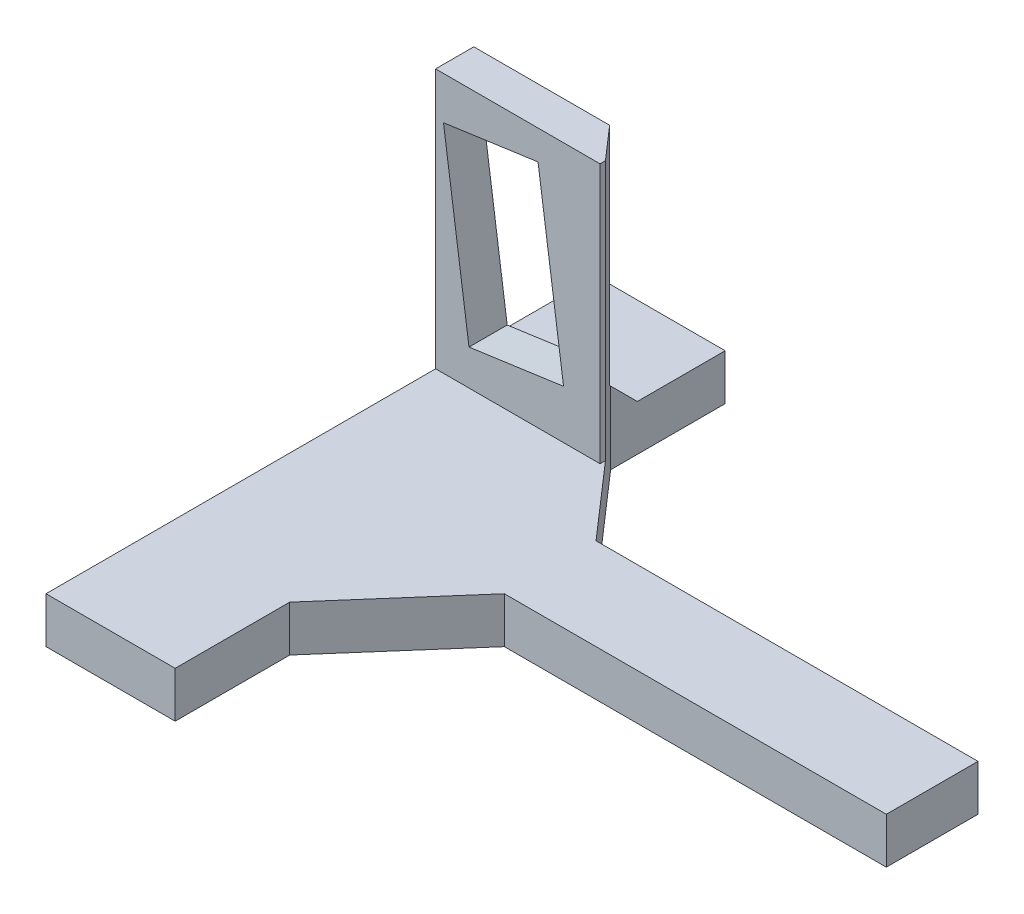
ISO-10303-21;
HEADER;
FILE_DESCRIPTION(('STEP AP214'),'2;1');
FILE_NAME('part.step','',(''),(''),'','','');
FILE_SCHEMA(('AUTOMOTIVE_DESIGN { 1 0 10303 214 1 1 1 1 }'));
ENDSEC;
DATA;
#1=APPLICATION_CONTEXT('core data for automotive mechanical design processes');
#2=APPLICATION_PROTOCOL_DEFINITION('international standard','automotive_design',2000,#1);
#3=PRODUCT_CONTEXT('',#1,'mechanical');
#4=PRODUCT('Part','Part','',(#3));
#5=PRODUCT_RELATED_PRODUCT_CATEGORY('part','',(#4));
#6=PRODUCT_DEFINITION_FORMATION('','',#4);
#7=PRODUCT_DEFINITION_CONTEXT('part definition',#1,'design');
#8=PRODUCT_DEFINITION('design','',#6,#7);
#9=PRODUCT_DEFINITION_SHAPE('','',#8);
#10=(LENGTH_UNIT() NAMED_UNIT(*) SI_UNIT(.MILLI.,.METRE.));
#11=(NAMED_UNIT(*) PLANE_ANGLE_UNIT() SI_UNIT($,.RADIAN.));
#12=(NAMED_UNIT(*) SI_UNIT($,.STERADIAN.) SOLID_ANGLE_UNIT());
#13=UNCERTAINTY_MEASURE_WITH_UNIT(LENGTH_MEASURE(1.E-05),#10,'distance_accuracy_value','');
#14=(GEOMETRIC_REPRESENTATION_CONTEXT(3) GLOBAL_UNCERTAINTY_ASSIGNED_CONTEXT((#13)) GLOBAL_UNIT_ASSIGNED_CONTEXT((#10,
#11,#12)) REPRESENTATION_CONTEXT('',''));
#15=CARTESIAN_POINT('',(0.,0.,0.));
#16=DIRECTION('',(0.,0.,1.));
#17=DIRECTION('',(1.,0.,0.));
#18=AXIS2_PLACEMENT_3D('',#15,#16,#17);
#19=CARTESIAN_POINT('',(0.,6.,0.));
#20=DIRECTION('',(0.,1.,0.));
#21=DIRECTION('',(0.,0.,1.));
#22=AXIS2_PLACEMENT_3D('',#19,#20,#21);
#23=PLANE('',#22);
#24=DIRECTION('',(0.,0.,1.));
#25=VECTOR('',#24,1.);
#26=CARTESIAN_POINT('',(-66.7608958865586,6.,-48.0812524177599));
#27=LINE('',#26,#25);
#28=CARTESIAN_POINT('',(-66.7608958865586,6.,-48.0812524177599));
#29=VERTEX_POINT('',#28);
#30=CARTESIAN_POINT('',(-66.7608958865586,6.,-36.5812524177599));
#31=VERTEX_POINT('',#30);
#32=EDGE_CURVE('E244',#29,#31,#27,.T.);
#33=ORIENTED_EDGE('',*,*,#32,.T.);
#34=DIRECTION('',(1.,0.,0.));
#35=VECTOR('',#34,1.);
#36=CARTESIAN_POINT('',(0.,6.,-36.5812524177599));
#37=LINE('',#36,#35);
#38=CARTESIAN_POINT('',(-49.8546901534253,6.,-36.5812524177599));
#39=VERTEX_POINT('',#38);
#40=EDGE_CURVE('E316',#31,#39,#37,.T.);
#41=ORIENTED_EDGE('',*,*,#40,.T.);
#42=DIRECTION('',(0.,0.,-1.));
#43=VECTOR('',#42,1.);
#44=CARTESIAN_POINT('',(-49.8546901534253,6.,-48.0812524177599));
#45=LINE('',#44,#43);
#46=CARTESIAN_POINT('',(-49.8546901534253,6.,-48.0812524177599));
#47=VERTEX_POINT('',#46);
#48=EDGE_CURVE('E261',#39,#47,#45,.T.);
#49=ORIENTED_EDGE('',*,*,#48,.T.);
#50=DIRECTION('',(-1.,0.,0.));
#51=VECTOR('',#50,1.);
#52=CARTESIAN_POINT('',(-66.7608958865586,6.,-48.0812524177599));
#53=LINE('',#52,#51);
#54=EDGE_CURVE('E263',#47,#29,#53,.T.);
#55=ORIENTED_EDGE('',*,*,#54,.T.);
#56=EDGE_LOOP('',(#33,#41,#49,#55));
#57=FACE_BOUND('',#56,.T.);
#58=ADVANCED_FACE('F37',(#57),#23,.T.);
#59=CARTESIAN_POINT('',(-66.7608958865586,6.,-6.0812524177599));
#60=DIRECTION('',(1.,0.,0.));
#61=DIRECTION('',(0.,0.,-1.));
#62=AXIS2_PLACEMENT_3D('',#59,#60,#61);
#63=PLANE('',#62);
#64=DIRECTION('',(0.,0.,1.));
#65=VECTOR('',#64,1.);
#66=CARTESIAN_POINT('',(-66.7608958865586,0.,-6.0812524177599));
#67=LINE('',#66,#65);
#68=CARTESIAN_POINT('',(-66.7608958865586,0.,-48.0812524177599));
#69=VERTEX_POINT('',#68);
#70=CARTESIAN_POINT('',(-66.7608958865586,0.,23.9187475822401));
#71=VERTEX_POINT('',#70);
#72=EDGE_CURVE('E243',#69,#71,#67,.T.);
#73=ORIENTED_EDGE('',*,*,#72,.T.);
#74=DIRECTION('',(0.,-1.,0.));
#75=VECTOR('',#74,1.);
#76=CARTESIAN_POINT('',(-66.7608958865586,6.,23.9187475822401));
#77=LINE('',#76,#75);
#78=CARTESIAN_POINT('',(-66.7608958865586,6.,23.9187475822401));
#79=VERTEX_POINT('',#78);
#80=EDGE_CURVE('E310',#79,#71,#77,.T.);
#81=ORIENTED_EDGE('',*,*,#80,.F.);
#82=CARTESIAN_POINT('',(-66.7608958865586,6.,-27.0812524177599));
#83=VERTEX_POINT('',#82);
#84=EDGE_CURVE('E247',#83,#79,#27,.T.);
#85=ORIENTED_EDGE('',*,*,#84,.F.);
#86=DIRECTION('',(0.,-1.,0.));
#87=VECTOR('',#86,1.);
#88=CARTESIAN_POINT('',(-66.7608958865586,40.,-27.0812524177599));
#89=LINE('',#88,#87);
#90=CARTESIAN_POINT('',(-66.7608958865586,40.,-27.0812524177599));
#91=VERTEX_POINT('',#90);
#92=EDGE_CURVE('E240',#91,#83,#89,.T.);
#93=ORIENTED_EDGE('',*,*,#92,.F.);
#94=DIRECTION('',(0.,0.,1.));
#95=VECTOR('',#94,1.);
#96=CARTESIAN_POINT('',(-66.7608958865586,40.,-32.0812524177599));
#97=LINE('',#96,#95);
#98=CARTESIAN_POINT('',(-66.7608958865586,40.,-32.0812524177599));
#99=VERTEX_POINT('',#98);
#100=EDGE_CURVE('E213',#99,#91,#97,.T.);
#101=ORIENTED_EDGE('',*,*,#100,.F.);
#102=DIRECTION('',(0.,-1.,0.));
#103=VECTOR('',#102,1.);
#104=CARTESIAN_POINT('',(-66.7608958865586,40.,-32.0812524177599));
#105=LINE('',#104,#103);
#106=CARTESIAN_POINT('',(-66.7608958865586,10.5,-32.0812524177599));
#107=VERTEX_POINT('',#106);
#108=EDGE_CURVE('E225',#99,#107,#105,.T.);
#109=ORIENTED_EDGE('',*,*,#108,.T.);
#110=DIRECTION('',(0.,-0.707106781186551,-0.707106781186544));
#111=VECTOR('',#110,1.);
#112=CARTESIAN_POINT('',(-66.7608958865586,21.25,-21.33125241776));
#113=LINE('',#112,#111);
#114=EDGE_CURVE('E59',#107,#31,#113,.T.);
#115=ORIENTED_EDGE('',*,*,#114,.T.);
#116=ORIENTED_EDGE('',*,*,#32,.F.);
#117=DIRECTION('',(0.,-1.,0.));
#118=VECTOR('',#117,1.);
#119=CARTESIAN_POINT('',(-66.7608958865586,6.,-48.0812524177599));
#120=LINE('',#119,#118);
#121=EDGE_CURVE('E265',#29,#69,#120,.T.);
#122=ORIENTED_EDGE('',*,*,#121,.T.);
#123=EDGE_LOOP('',(#73,#81,#85,#93,#101,#109,#115,#116,#122));
#124=FACE_BOUND('',#123,.T.);
#125=ADVANCED_FACE('F348',(#124),#63,.F.);
#126=CARTESIAN_POINT('',(-66.7608958865586,6.,23.9187475822401));
#127=DIRECTION('',(0.,0.,-1.));
#128=DIRECTION('',(-1.,0.,0.));
#129=AXIS2_PLACEMENT_3D('',#126,#127,#128);
#130=PLANE('',#129);
#131=DIRECTION('',(1.,0.,0.));
#132=VECTOR('',#131,1.);
#133=CARTESIAN_POINT('',(-66.7608958865586,0.,23.9187475822401));
#134=LINE('',#133,#132);
#135=CARTESIAN_POINT('',(-49.8546901534253,0.,23.9187475822401));
#136=VERTEX_POINT('',#135);
#137=EDGE_CURVE('E267',#71,#136,#134,.T.);
#138=ORIENTED_EDGE('',*,*,#137,.T.);
#139=DIRECTION('',(0.,-1.,0.));
#140=VECTOR('',#139,1.);
#141=CARTESIAN_POINT('',(-49.8546901534253,6.,23.9187475822401));
#142=LINE('',#141,#140);
#143=CARTESIAN_POINT('',(-49.8546901534253,6.,23.9187475822401));
#144=VERTEX_POINT('',#143);
#145=EDGE_CURVE('E307',#144,#136,#142,.T.);
#146=ORIENTED_EDGE('',*,*,#145,.F.);
#147=DIRECTION('',(1.,0.,0.));
#148=VECTOR('',#147,1.);
#149=CARTESIAN_POINT('',(-66.7608958865586,6.,23.9187475822401));
#150=LINE('',#149,#148);
#151=EDGE_CURVE('E246',#79,#144,#150,.T.);
#152=ORIENTED_EDGE('',*,*,#151,.F.);
#153=ORIENTED_EDGE('',*,*,#80,.T.);
#154=EDGE_LOOP('',(#138,#146,#152,#153));
#155=FACE_BOUND('',#154,.T.);
#156=ADVANCED_FACE('F355',(#155),#130,.F.);
#157=CARTESIAN_POINT('',(-49.8546901534253,6.,8.91874758224009));
#158=DIRECTION('',(-1.,0.,0.));
#159=DIRECTION('',(0.,0.,1.));
#160=AXIS2_PLACEMENT_3D('',#157,#158,#159);
#161=PLANE('',#160);
#162=DIRECTION('',(0.,0.,-1.));
#163=VECTOR('',#162,1.);
#164=CARTESIAN_POINT('',(-49.8546901534253,0.,8.91874758224009));
#165=LINE('',#164,#163);
#166=CARTESIAN_POINT('',(-49.8546901534253,0.,8.91874758224009));
#167=VERTEX_POINT('',#166);
#168=EDGE_CURVE('E269',#136,#167,#165,.T.);
#169=ORIENTED_EDGE('',*,*,#168,.T.);
#170=DIRECTION('',(0.,-1.,0.));
#171=VECTOR('',#170,1.);
#172=CARTESIAN_POINT('',(-49.8546901534253,6.,8.91874758224009));
#173=LINE('',#172,#171);
#174=CARTESIAN_POINT('',(-49.8546901534253,6.,8.91874758224009));
#175=VERTEX_POINT('',#174);
#176=EDGE_CURVE('E304',#175,#167,#173,.T.);
#177=ORIENTED_EDGE('',*,*,#176,.F.);
#178=DIRECTION('',(0.,0.,-1.));
#179=VECTOR('',#178,1.);
#180=CARTESIAN_POINT('',(-49.8546901534253,6.,8.91874758224009));
#181=LINE('',#180,#179);
#182=EDGE_CURVE('E249',#144,#175,#181,.T.);
#183=ORIENTED_EDGE('',*,*,#182,.F.);
#184=ORIENTED_EDGE('',*,*,#145,.T.);
#185=EDGE_LOOP('',(#169,#177,#183,#184));
#186=FACE_BOUND('',#185,.T.);
#187=ADVANCED_FACE('F359',(#186),#161,.F.);
#188=CARTESIAN_POINT('',(-49.8546901534253,6.,8.91874758224009));
#189=DIRECTION('',(-0.753352867384216,0.,-0.65761649705887));
#190=DIRECTION('',(-0.65761649705887,0.,0.753352867384216));
#191=AXIS2_PLACEMENT_3D('',#188,#189,#190);
#192=PLANE('',#191);
#193=DIRECTION('',(0.65761649705887,0.,-0.753352867384216));
#194=VECTOR('',#193,1.);
#195=CARTESIAN_POINT('',(-49.8546901534253,0.,8.91874758224009));
#196=LINE('',#195,#194);
#197=CARTESIAN_POINT('',(-36.7608958865586,0.,-6.0812524177599));
#198=VERTEX_POINT('',#197);
#199=EDGE_CURVE('E271',#167,#198,#196,.T.);
#200=ORIENTED_EDGE('',*,*,#199,.T.);
#201=DIRECTION('',(0.,-1.,0.));
#202=VECTOR('',#201,1.);
#203=CARTESIAN_POINT('',(-36.7608958865586,6.,-6.0812524177599));
#204=LINE('',#203,#202);
#205=CARTESIAN_POINT('',(-36.7608958865586,6.,-6.0812524177599));
#206=VERTEX_POINT('',#205);
#207=EDGE_CURVE('E301',#206,#198,#204,.T.);
#208=ORIENTED_EDGE('',*,*,#207,.F.);
#209=DIRECTION('',(0.65761649705887,0.,-0.753352867384216));
#210=VECTOR('',#209,1.);
#211=CARTESIAN_POINT('',(-49.8546901534253,6.,8.91874758224009));
#212=LINE('',#211,#210);
#213=EDGE_CURVE('E251',#175,#206,#212,.T.);
#214=ORIENTED_EDGE('',*,*,#213,.F.);
#215=ORIENTED_EDGE('',*,*,#176,.T.);
#216=EDGE_LOOP('',(#200,#208,#214,#215));
#217=FACE_BOUND('',#216,.T.);
#218=ADVANCED_FACE('F364',(#217),#192,.F.);
#219=CARTESIAN_POINT('',(-36.7608958865586,6.,-6.0812524177599));
#220=DIRECTION('',(0.,0.,-1.));
#221=DIRECTION('',(-1.,0.,0.));
#222=AXIS2_PLACEMENT_3D('',#219,#220,#221);
#223=PLANE('',#222);
#224=DIRECTION('',(1.,0.,0.));
#225=VECTOR('',#224,1.);
#226=CARTESIAN_POINT('',(-36.7608958865586,0.,-6.0812524177599));
#227=LINE('',#226,#225);
#228=CARTESIAN_POINT('',(13.2391041134414,0.,-6.0812524177599));
#229=VERTEX_POINT('',#228);
#230=EDGE_CURVE('E273',#198,#229,#227,.T.);
#231=ORIENTED_EDGE('',*,*,#230,.T.);
#232=DIRECTION('',(0.,-1.,0.));
#233=VECTOR('',#232,1.);
#234=CARTESIAN_POINT('',(13.2391041134414,6.,-6.0812524177599));
#235=LINE('',#234,#233);
#236=CARTESIAN_POINT('',(13.2391041134414,6.,-6.0812524177599));
#237=VERTEX_POINT('',#236);
#238=EDGE_CURVE('E298',#237,#229,#235,.T.);
#239=ORIENTED_EDGE('',*,*,#238,.F.);
#240=DIRECTION('',(1.,0.,0.));
#241=VECTOR('',#240,1.);
#242=CARTESIAN_POINT('',(-36.7608958865586,6.,-6.0812524177599));
#243=LINE('',#242,#241);
#244=EDGE_CURVE('E253',#206,#237,#243,.T.);
#245=ORIENTED_EDGE('',*,*,#244,.F.);
#246=ORIENTED_EDGE('',*,*,#207,.T.);
#247=EDGE_LOOP('',(#231,#239,#245,#246));
#248=FACE_BOUND('',#247,.T.);
#249=ADVANCED_FACE('F370',(#248),#223,.F.);
#250=CARTESIAN_POINT('',(13.2391041134414,6.,-18.0812524177599));
#251=DIRECTION('',(-1.,0.,0.));
#252=DIRECTION('',(0.,0.,1.));
#253=AXIS2_PLACEMENT_3D('',#250,#251,#252);
#254=PLANE('',#253);
#255=DIRECTION('',(0.,0.,-1.));
#256=VECTOR('',#255,1.);
#257=CARTESIAN_POINT('',(13.2391041134414,0.,-18.0812524177599));
#258=LINE('',#257,#256);
#259=CARTESIAN_POINT('',(13.2391041134414,0.,-18.0812524177599));
#260=VERTEX_POINT('',#259);
#261=EDGE_CURVE('E275',#229,#260,#258,.T.);
#262=ORIENTED_EDGE('',*,*,#261,.T.);
#263=DIRECTION('',(0.,-1.,0.));
#264=VECTOR('',#263,1.);
#265=CARTESIAN_POINT('',(13.2391041134414,6.,-18.0812524177599));
#266=LINE('',#265,#264);
#267=CARTESIAN_POINT('',(13.2391041134414,6.,-18.0812524177599));
#268=VERTEX_POINT('',#267);
#269=EDGE_CURVE('E295',#268,#260,#266,.T.);
#270=ORIENTED_EDGE('',*,*,#269,.F.);
#271=DIRECTION('',(0.,0.,-1.));
#272=VECTOR('',#271,1.);
#273=CARTESIAN_POINT('',(13.2391041134414,6.,-18.0812524177599));
#274=LINE('',#273,#272);
#275=EDGE_CURVE('E255',#237,#268,#274,.T.);
#276=ORIENTED_EDGE('',*,*,#275,.F.);
#277=ORIENTED_EDGE('',*,*,#238,.T.);
#278=EDGE_LOOP('',(#262,#270,#276,#277));
#279=FACE_BOUND('',#278,.T.);
#280=ADVANCED_FACE('F374',(#279),#254,.F.);
#281=CARTESIAN_POINT('',(-36.7608958865586,6.,-18.0812524177599));
#282=DIRECTION('',(0.,0.,1.));
#283=DIRECTION('',(1.,0.,0.));
#284=AXIS2_PLACEMENT_3D('',#281,#282,#283);
#285=PLANE('',#284);
#286=DIRECTION('',(-1.,0.,0.));
#287=VECTOR('',#286,1.);
#288=CARTESIAN_POINT('',(-36.7608958865586,0.,-18.0812524177599));
#289=LINE('',#288,#287);
#290=CARTESIAN_POINT('',(-36.7608958865586,0.,-18.0812524177599));
#291=VERTEX_POINT('',#290);
#292=EDGE_CURVE('E277',#260,#291,#289,.T.);
#293=ORIENTED_EDGE('',*,*,#292,.T.);
#294=DIRECTION('',(0.,-1.,0.));
#295=VECTOR('',#294,1.);
#296=CARTESIAN_POINT('',(-36.7608958865586,6.,-18.0812524177599));
#297=LINE('',#296,#295);
#298=CARTESIAN_POINT('',(-36.7608958865586,6.,-18.0812524177599));
#299=VERTEX_POINT('',#298);
#300=EDGE_CURVE('E292',#299,#291,#297,.T.);
#301=ORIENTED_EDGE('',*,*,#300,.F.);
#302=DIRECTION('',(-1.,0.,0.));
#303=VECTOR('',#302,1.);
#304=CARTESIAN_POINT('',(-36.7608958865586,6.,-18.0812524177599));
#305=LINE('',#304,#303);
#306=EDGE_CURVE('E257',#268,#299,#305,.T.);
#307=ORIENTED_EDGE('',*,*,#306,.F.);
#308=ORIENTED_EDGE('',*,*,#269,.T.);
#309=EDGE_LOOP('',(#293,#301,#307,#308));
#310=FACE_BOUND('',#309,.T.);
#311=ADVANCED_FACE('F379',(#310),#285,.F.);
#312=CARTESIAN_POINT('',(-49.8546901534253,6.,-33.0812524177599));
#313=DIRECTION('',(-0.753352867384216,0.,0.65761649705887));
#314=DIRECTION('',(0.65761649705887,0.,0.753352867384216));
#315=AXIS2_PLACEMENT_3D('',#312,#313,#314);
#316=PLANE('',#315);
#317=DIRECTION('',(-0.65761649705887,0.,-0.753352867384216));
#318=VECTOR('',#317,1.);
#319=CARTESIAN_POINT('',(-49.8546901534253,0.,-33.0812524177599));
#320=LINE('',#319,#318);
#321=CARTESIAN_POINT('',(-49.8546901534253,0.,-33.0812524177599));
#322=VERTEX_POINT('',#321);
#323=EDGE_CURVE('E279',#291,#322,#320,.T.);
#324=ORIENTED_EDGE('',*,*,#323,.T.);
#325=DIRECTION('',(0.,-1.,0.));
#326=VECTOR('',#325,1.);
#327=CARTESIAN_POINT('',(-49.8546901534253,6.,-33.0812524177599));
#328=LINE('',#327,#326);
#329=CARTESIAN_POINT('',(-49.8546901534253,9.50000000000001,-33.0812524177599));
#330=VERTEX_POINT('',#329);
#331=EDGE_CURVE('E51',#330,#322,#328,.T.);
#332=ORIENTED_EDGE('',*,*,#331,.F.);
#333=DIRECTION('',(0.525246670747035,0.601712528899458,0.601712528899453));
#334=VECTOR('',#333,1.);
#335=CARTESIAN_POINT('',(-50.9608564123546,8.23279711397897,-34.3484553037809));
#336=LINE('',#335,#334);
#337=CARTESIAN_POINT('',(-48.9817705356342,10.5,-32.0812524177599));
#338=VERTEX_POINT('',#337);
#339=EDGE_CURVE('E11',#330,#338,#336,.T.);
#340=ORIENTED_EDGE('',*,*,#339,.T.);
#341=DIRECTION('',(0.,-1.,0.));
#342=VECTOR('',#341,1.);
#343=CARTESIAN_POINT('',(-48.9817705356342,40.,-32.0812524177599));
#344=LINE('',#343,#342);
#345=CARTESIAN_POINT('',(-48.9817705356342,40.,-32.0812524177599));
#346=VERTEX_POINT('',#345);
#347=EDGE_CURVE('E231',#346,#338,#344,.T.);
#348=ORIENTED_EDGE('',*,*,#347,.F.);
#349=DIRECTION('',(-0.657616497058871,0.,-0.753352867384216));
#350=VECTOR('',#349,1.);
#351=CARTESIAN_POINT('',(-45.2333870796828,40.,-27.7871761024211));
#352=LINE('',#351,#350);
#353=CARTESIAN_POINT('',(-45.2333870796828,40.,-27.7871761024211));
#354=VERTEX_POINT('',#353);
#355=EDGE_CURVE('E221',#354,#346,#352,.T.);
#356=ORIENTED_EDGE('',*,*,#355,.F.);
#357=DIRECTION('',(0.,-1.,0.));
#358=VECTOR('',#357,1.);
#359=CARTESIAN_POINT('',(-45.2333870796828,40.,-27.7871761024211));
#360=LINE('',#359,#358);
#361=CARTESIAN_POINT('',(-45.2333870796828,6.,-27.7871761024211));
#362=VERTEX_POINT('',#361);
#363=EDGE_CURVE('E234',#354,#362,#360,.T.);
#364=ORIENTED_EDGE('',*,*,#363,.T.);
#365=DIRECTION('',(-0.65761649705887,0.,-0.753352867384216));
#366=VECTOR('',#365,1.);
#367=CARTESIAN_POINT('',(-49.8546901534253,6.,-33.0812524177599));
#368=LINE('',#367,#366);
#369=EDGE_CURVE('E259',#299,#362,#368,.T.);
#370=ORIENTED_EDGE('',*,*,#369,.F.);
#371=ORIENTED_EDGE('',*,*,#300,.T.);
#372=EDGE_LOOP('',(#324,#332,#340,#348,#356,#364,#370,#371));
#373=FACE_BOUND('',#372,.T.);
#374=ADVANCED_FACE('F329',(#373),#316,.F.);
#375=CARTESIAN_POINT('',(-49.8546901534253,6.,-48.0812524177599));
#376=DIRECTION('',(-1.,0.,0.));
#377=DIRECTION('',(0.,0.,1.));
#378=AXIS2_PLACEMENT_3D('',#375,#376,#377);
#379=PLANE('',#378);
#380=DIRECTION('',(0.,0.,-1.));
#381=VECTOR('',#380,1.);
#382=CARTESIAN_POINT('',(-49.8546901534253,0.,-48.0812524177599));
#383=LINE('',#382,#381);
#384=CARTESIAN_POINT('',(-49.8546901534253,0.,-48.0812524177599));
#385=VERTEX_POINT('',#384);
#386=EDGE_CURVE('E281',#322,#385,#383,.T.);
#387=ORIENTED_EDGE('',*,*,#386,.T.);
#388=DIRECTION('',(0.,-1.,0.));
#389=VECTOR('',#388,1.);
#390=CARTESIAN_POINT('',(-49.8546901534253,6.,-48.0812524177599));
#391=LINE('',#390,#389);
#392=EDGE_CURVE('E288',#47,#385,#391,.T.);
#393=ORIENTED_EDGE('',*,*,#392,.F.);
#394=ORIENTED_EDGE('',*,*,#48,.F.);
#395=DIRECTION('',(0.,0.707106781186551,0.707106781186544));
#396=VECTOR('',#395,1.);
#397=CARTESIAN_POINT('',(-49.8546901534253,0.249999999999992,-42.3312524177598));
#398=LINE('',#397,#396);
#399=EDGE_CURVE('E45',#39,#330,#398,.T.);
#400=ORIENTED_EDGE('',*,*,#399,.T.);
#401=ORIENTED_EDGE('',*,*,#331,.T.);
#402=EDGE_LOOP('',(#387,#393,#394,#400,#401));
#403=FACE_BOUND('',#402,.T.);
#404=ADVANCED_FACE('F322',(#403),#379,.F.);
#405=CARTESIAN_POINT('',(-66.7608958865586,6.,-48.0812524177599));
#406=DIRECTION('',(0.,0.,1.));
#407=DIRECTION('',(1.,0.,0.));
#408=AXIS2_PLACEMENT_3D('',#405,#406,#407);
#409=PLANE('',#408);
#410=DIRECTION('',(-1.,0.,0.));
#411=VECTOR('',#410,1.);
#412=CARTESIAN_POINT('',(-66.7608958865586,0.,-48.0812524177599));
#413=LINE('',#412,#411);
#414=EDGE_CURVE('E283',#385,#69,#413,.T.);
#415=ORIENTED_EDGE('',*,*,#414,.T.);
#416=ORIENTED_EDGE('',*,*,#121,.F.);
#417=ORIENTED_EDGE('',*,*,#54,.F.);
#418=ORIENTED_EDGE('',*,*,#392,.T.);
#419=EDGE_LOOP('',(#415,#416,#417,#418));
#420=FACE_BOUND('',#419,.T.);
#421=ADVANCED_FACE('F386',(#420),#409,.F.);
#422=DIRECTION('',(0.,0.,-1.));
#423=VECTOR('',#422,1.);
#424=CARTESIAN_POINT('',(-45.2333870796828,6.,-27.7871761024211));
#425=LINE('',#424,#423);
#426=CARTESIAN_POINT('',(-45.2333870796828,6.,-27.0812524177599));
#427=VERTEX_POINT('',#426);
#428=EDGE_CURVE('E217',#427,#362,#425,.T.);
#429=ORIENTED_EDGE('',*,*,#428,.F.);
#430=DIRECTION('',(1.,0.,0.));
#431=VECTOR('',#430,1.);
#432=CARTESIAN_POINT('',(-66.7608958865586,6.,-27.0812524177599));
#433=LINE('',#432,#431);
#434=EDGE_CURVE('E211',#83,#427,#433,.T.);
#435=ORIENTED_EDGE('',*,*,#434,.F.);
#436=ORIENTED_EDGE('',*,*,#84,.T.);
#437=ORIENTED_EDGE('',*,*,#151,.T.);
#438=ORIENTED_EDGE('',*,*,#182,.T.);
#439=ORIENTED_EDGE('',*,*,#213,.T.);
#440=ORIENTED_EDGE('',*,*,#244,.T.);
#441=ORIENTED_EDGE('',*,*,#275,.T.);
#442=ORIENTED_EDGE('',*,*,#306,.T.);
#443=ORIENTED_EDGE('',*,*,#369,.T.);
#444=EDGE_LOOP('',(#429,#435,#436,#437,#438,#439,#440,#441,#442,#443));
#445=FACE_BOUND('',#444,.T.);
#446=ADVANCED_FACE('F344',(#445),#23,.T.);
#447=CARTESIAN_POINT('',(0.,0.,0.));
#448=DIRECTION('',(0.,1.,0.));
#449=DIRECTION('',(0.,0.,1.));
#450=AXIS2_PLACEMENT_3D('',#447,#448,#449);
#451=PLANE('',#450);
#452=ORIENTED_EDGE('',*,*,#72,.F.);
#453=ORIENTED_EDGE('',*,*,#414,.F.);
#454=ORIENTED_EDGE('',*,*,#386,.F.);
#455=ORIENTED_EDGE('',*,*,#323,.F.);
#456=ORIENTED_EDGE('',*,*,#292,.F.);
#457=ORIENTED_EDGE('',*,*,#261,.F.);
#458=ORIENTED_EDGE('',*,*,#230,.F.);
#459=ORIENTED_EDGE('',*,*,#199,.F.);
#460=ORIENTED_EDGE('',*,*,#168,.F.);
#461=ORIENTED_EDGE('',*,*,#137,.F.);
#462=EDGE_LOOP('',(#452,#453,#454,#455,#456,#457,#458,#459,#460,#461));
#463=FACE_BOUND('',#462,.T.);
#464=ADVANCED_FACE('F382',(#463),#451,.F.);
#465=CARTESIAN_POINT('',(-66.7608958865586,40.,-27.0812524177599));
#466=DIRECTION('',(0.,0.,-1.));
#467=DIRECTION('',(-1.,0.,0.));
#468=AXIS2_PLACEMENT_3D('',#465,#466,#467);
#469=PLANE('',#468);
#470=DIRECTION('',(-0.99026806874157,-0.139173100960065,0.));
#471=VECTOR('',#470,1.);
#472=CARTESIAN_POINT('',(-53.3522349929824,36.1530487058993,-27.0812524177599));
#473=LINE('',#472,#471);
#474=CARTESIAN_POINT('',(-53.3522349929824,36.1530487058993,-27.0812524177599));
#475=VERTEX_POINT('',#474);
#476=CARTESIAN_POINT('',(-65.730585852252,34.4133849438984,-27.0812524177599));
#477=VERTEX_POINT('',#476);
#478=EDGE_CURVE('E573',#475,#477,#473,.T.);
#479=ORIENTED_EDGE('',*,*,#478,.F.);
#480=DIRECTION('',(-0.139173100960066,0.99026806874157,0.));
#481=VECTOR('',#480,1.);
#482=CARTESIAN_POINT('',(-53.3522349929824,36.1530487058993,-27.0812524177599));
#483=LINE('',#482,#481);
#484=CARTESIAN_POINT('',(-50.0120805699408,12.3866150561016,-27.0812524177599));
#485=VERTEX_POINT('',#484);
#486=EDGE_CURVE('E212',#485,#475,#483,.T.);
#487=ORIENTED_EDGE('',*,*,#486,.F.);
#488=DIRECTION('',(0.99026806874157,0.139173100960066,0.));
#489=VECTOR('',#488,1.);
#490=CARTESIAN_POINT('',(-50.0120805699408,12.3866150561016,-27.0812524177599));
#491=LINE('',#490,#489);
#492=CARTESIAN_POINT('',(-62.3904314292104,10.6469512941007,-27.0812524177599));
#493=VERTEX_POINT('',#492);
#494=EDGE_CURVE('E209',#493,#485,#491,.T.);
#495=ORIENTED_EDGE('',*,*,#494,.F.);
#496=DIRECTION('',(0.139173100960065,-0.99026806874157,0.));
#497=VECTOR('',#496,1.);
#498=CARTESIAN_POINT('',(-65.730585852252,34.4133849438984,-27.0812524177599));
#499=LINE('',#498,#497);
#500=EDGE_CURVE('E182',#477,#493,#499,.T.);
#501=ORIENTED_EDGE('',*,*,#500,.F.);
#502=EDGE_LOOP('',(#479,#487,#495,#501));
#503=FACE_BOUND('',#502,.T.);
#504=ORIENTED_EDGE('',*,*,#434,.T.);
#505=DIRECTION('',(0.,-1.,0.));
#506=VECTOR('',#505,1.);
#507=CARTESIAN_POINT('',(-45.2333870796828,40.,-27.0812524177599));
#508=LINE('',#507,#506);
#509=CARTESIAN_POINT('',(-45.2333870796828,40.,-27.0812524177599));
#510=VERTEX_POINT('',#509);
#511=EDGE_CURVE('E237',#510,#427,#508,.T.);
#512=ORIENTED_EDGE('',*,*,#511,.F.);
#513=DIRECTION('',(1.,0.,0.));
#514=VECTOR('',#513,1.);
#515=CARTESIAN_POINT('',(-66.7608958865586,40.,-27.0812524177599));
#516=LINE('',#515,#514);
#517=EDGE_CURVE('E216',#91,#510,#516,.T.);
#518=ORIENTED_EDGE('',*,*,#517,.F.);
#519=ORIENTED_EDGE('',*,*,#92,.T.);
#520=EDGE_LOOP('',(#504,#512,#518,#519));
#521=FACE_BOUND('',#520,.T.);
#522=ADVANCED_FACE('F347',(#503,#521),#469,.F.);
#523=CARTESIAN_POINT('',(-45.2333870796828,40.,-27.7871761024211));
#524=DIRECTION('',(-1.,0.,0.));
#525=DIRECTION('',(0.,0.,1.));
#526=AXIS2_PLACEMENT_3D('',#523,#524,#525);
#527=PLANE('',#526);
#528=ORIENTED_EDGE('',*,*,#428,.T.);
#529=ORIENTED_EDGE('',*,*,#363,.F.);
#530=DIRECTION('',(0.,0.,-1.));
#531=VECTOR('',#530,1.);
#532=CARTESIAN_POINT('',(-45.2333870796828,40.,-27.7871761024211));
#533=LINE('',#532,#531);
#534=EDGE_CURVE('E219',#510,#354,#533,.T.);
#535=ORIENTED_EDGE('',*,*,#534,.F.);
#536=ORIENTED_EDGE('',*,*,#511,.T.);
#537=EDGE_LOOP('',(#528,#529,#535,#536));
#538=FACE_BOUND('',#537,.T.);
#539=ADVANCED_FACE('F341',(#538),#527,.F.);
#540=CARTESIAN_POINT('',(-66.7608958865586,40.,-32.0812524177599));
#541=DIRECTION('',(0.,0.,1.));
#542=DIRECTION('',(1.,0.,0.));
#543=AXIS2_PLACEMENT_3D('',#540,#541,#542);
#544=PLANE('',#543);
#545=DIRECTION('',(-0.99026806874157,-0.139173100960066,0.));
#546=VECTOR('',#545,1.);
#547=CARTESIAN_POINT('',(-50.0120805699408,12.3866150561016,-32.0812524177599));
#548=LINE('',#547,#546);
#549=CARTESIAN_POINT('',(-50.0120805699408,12.3866150561016,-32.0812524177599));
#550=VERTEX_POINT('',#549);
#551=CARTESIAN_POINT('',(-62.3904314292104,10.6469512941007,-32.0812524177599));
#552=VERTEX_POINT('',#551);
#553=EDGE_CURVE('E190',#550,#552,#548,.T.);
#554=ORIENTED_EDGE('',*,*,#553,.F.);
#555=DIRECTION('',(0.139173100960066,-0.99026806874157,0.));
#556=VECTOR('',#555,1.);
#557=CARTESIAN_POINT('',(-53.3522349929824,36.1530487058993,-32.0812524177599));
#558=LINE('',#557,#556);
#559=CARTESIAN_POINT('',(-53.3522349929824,36.1530487058993,-32.0812524177599));
#560=VERTEX_POINT('',#559);
#561=EDGE_CURVE('E195',#560,#550,#558,.T.);
#562=ORIENTED_EDGE('',*,*,#561,.F.);
#563=DIRECTION('',(0.99026806874157,0.139173100960065,0.));
#564=VECTOR('',#563,1.);
#565=CARTESIAN_POINT('',(-53.3522349929824,36.1530487058993,-32.0812524177599));
#566=LINE('',#565,#564);
#567=CARTESIAN_POINT('',(-65.730585852252,34.4133849438984,-32.0812524177599));
#568=VERTEX_POINT('',#567);
#569=EDGE_CURVE('E200',#568,#560,#566,.T.);
#570=ORIENTED_EDGE('',*,*,#569,.F.);
#571=DIRECTION('',(-0.139173100960065,0.99026806874157,0.));
#572=VECTOR('',#571,1.);
#573=CARTESIAN_POINT('',(-65.730585852252,34.4133849438984,-32.0812524177599));
#574=LINE('',#573,#572);
#575=EDGE_CURVE('E179',#552,#568,#574,.T.);
#576=ORIENTED_EDGE('',*,*,#575,.F.);
#577=EDGE_LOOP('',(#554,#562,#570,#576));
#578=FACE_BOUND('',#577,.T.);
#579=ORIENTED_EDGE('',*,*,#347,.T.);
#580=DIRECTION('',(-1.,0.,0.));
#581=VECTOR('',#580,1.);
#582=CARTESIAN_POINT('',(-66.7608958865586,10.5,-32.0812524177599));
#583=LINE('',#582,#581);
#584=EDGE_CURVE('E313',#338,#107,#583,.T.);
#585=ORIENTED_EDGE('',*,*,#584,.T.);
#586=ORIENTED_EDGE('',*,*,#108,.F.);
#587=DIRECTION('',(-1.,0.,0.));
#588=VECTOR('',#587,1.);
#589=CARTESIAN_POINT('',(-66.7608958865586,40.,-32.0812524177599));
#590=LINE('',#589,#588);
#591=EDGE_CURVE('E223',#346,#99,#590,.T.);
#592=ORIENTED_EDGE('',*,*,#591,.F.);
#593=EDGE_LOOP('',(#579,#585,#586,#592));
#594=FACE_BOUND('',#593,.T.);
#595=ADVANCED_FACE('F197',(#578,#594),#544,.F.);
#596=CARTESIAN_POINT('',(0.,40.,0.));
#597=DIRECTION('',(0.,1.,0.));
#598=DIRECTION('',(0.,0.,1.));
#599=AXIS2_PLACEMENT_3D('',#596,#597,#598);
#600=PLANE('',#599);
#601=ORIENTED_EDGE('',*,*,#100,.T.);
#602=ORIENTED_EDGE('',*,*,#517,.T.);
#603=ORIENTED_EDGE('',*,*,#534,.T.);
#604=ORIENTED_EDGE('',*,*,#355,.T.);
#605=ORIENTED_EDGE('',*,*,#591,.T.);
#606=EDGE_LOOP('',(#601,#602,#603,#604,#605));
#607=FACE_BOUND('',#606,.T.);
#608=ADVANCED_FACE('F335',(#607),#600,.T.);
#609=CARTESIAN_POINT('',(-53.3522349929824,36.1530487058993,2.87926182165527));
#610=DIRECTION('',(0.99026806874157,0.139173100960065,0.));
#611=DIRECTION('',(-0.139173100960066,0.99026806874157,0.));
#612=AXIS2_PLACEMENT_3D('',#609,#610,#611);
#613=PLANE('',#612);
#614=ORIENTED_EDGE('',*,*,#486,.T.);
#615=DIRECTION('',(0.,0.,-1.));
#616=VECTOR('',#615,1.);
#617=CARTESIAN_POINT('',(-53.3522349929824,36.1530487058993,2.87926182165527));
#618=LINE('',#617,#616);
#619=EDGE_CURVE('E205',#475,#560,#618,.T.);
#620=ORIENTED_EDGE('',*,*,#619,.T.);
#621=ORIENTED_EDGE('',*,*,#561,.T.);
#622=DIRECTION('',(0.,0.,-1.));
#623=VECTOR('',#622,1.);
#624=CARTESIAN_POINT('',(-50.0120805699408,12.3866150561016,2.87926182165527));
#625=LINE('',#624,#623);
#626=EDGE_CURVE('E186',#485,#550,#625,.T.);
#627=ORIENTED_EDGE('',*,*,#626,.F.);
#628=EDGE_LOOP('',(#614,#620,#621,#627));
#629=FACE_BOUND('',#628,.T.);
#630=ADVANCED_FACE('F494',(#629),#613,.F.);
#631=CARTESIAN_POINT('',(-53.3522349929824,36.1530487058993,2.87926182165527));
#632=DIRECTION('',(-0.139173100960065,0.99026806874157,0.));
#633=DIRECTION('',(-0.99026806874157,-0.139173100960065,0.));
#634=AXIS2_PLACEMENT_3D('',#631,#632,#633);
#635=PLANE('',#634);
#636=ORIENTED_EDGE('',*,*,#478,.T.);
#637=DIRECTION('',(0.,0.,-1.));
#638=VECTOR('',#637,1.);
#639=CARTESIAN_POINT('',(-65.730585852252,34.4133849438984,2.87926182165527));
#640=LINE('',#639,#638);
#641=EDGE_CURVE('E185',#477,#568,#640,.T.);
#642=ORIENTED_EDGE('',*,*,#641,.T.);
#643=ORIENTED_EDGE('',*,*,#569,.T.);
#644=ORIENTED_EDGE('',*,*,#619,.F.);
#645=EDGE_LOOP('',(#636,#642,#643,#644));
#646=FACE_BOUND('',#645,.T.);
#647=ADVANCED_FACE('F487',(#646),#635,.F.);
#648=CARTESIAN_POINT('',(-65.730585852252,34.4133849438984,2.87926182165527));
#649=DIRECTION('',(-0.99026806874157,-0.139173100960065,0.));
#650=DIRECTION('',(0.139173100960065,-0.99026806874157,0.));
#651=AXIS2_PLACEMENT_3D('',#648,#649,#650);
#652=PLANE('',#651);
#653=ORIENTED_EDGE('',*,*,#500,.T.);
#654=DIRECTION('',(0.,0.,-1.));
#655=VECTOR('',#654,1.);
#656=CARTESIAN_POINT('',(-62.3904314292104,10.6469512941007,2.87926182165527));
#657=LINE('',#656,#655);
#658=EDGE_CURVE('E174',#493,#552,#657,.T.);
#659=ORIENTED_EDGE('',*,*,#658,.T.);
#660=ORIENTED_EDGE('',*,*,#575,.T.);
#661=ORIENTED_EDGE('',*,*,#641,.F.);
#662=EDGE_LOOP('',(#653,#659,#660,#661));
#663=FACE_BOUND('',#662,.T.);
#664=ADVANCED_FACE('F176',(#663),#652,.F.);
#665=CARTESIAN_POINT('',(-50.0120805699408,12.3866150561016,2.87926182165527));
#666=DIRECTION('',(0.139173100960066,-0.99026806874157,0.));
#667=DIRECTION('',(0.99026806874157,0.139173100960066,0.));
#668=AXIS2_PLACEMENT_3D('',#665,#666,#667);
#669=PLANE('',#668);
#670=ORIENTED_EDGE('',*,*,#494,.T.);
#671=ORIENTED_EDGE('',*,*,#626,.T.);
#672=ORIENTED_EDGE('',*,*,#553,.T.);
#673=ORIENTED_EDGE('',*,*,#658,.F.);
#674=EDGE_LOOP('',(#670,#671,#672,#673));
#675=FACE_BOUND('',#674,.T.);
#676=ADVANCED_FACE('F191',(#675),#669,.F.);
#677=CARTESIAN_POINT('',(-66.7608958865586,10.5,-32.0812524177599));
#678=DIRECTION('',(0.,-0.707106781186544,0.707106781186551));
#679=DIRECTION('',(-1.,0.,0.));
#680=AXIS2_PLACEMENT_3D('',#677,#678,#679);
#681=PLANE('',#680);
#682=ORIENTED_EDGE('',*,*,#399,.F.);
#683=ORIENTED_EDGE('',*,*,#40,.F.);
#684=ORIENTED_EDGE('',*,*,#114,.F.);
#685=ORIENTED_EDGE('',*,*,#584,.F.);
#686=ORIENTED_EDGE('',*,*,#339,.F.);
#687=EDGE_LOOP('',(#682,#683,#684,#685,#686));
#688=FACE_BOUND('',#687,.T.);
#689=ADVANCED_FACE('F39',(#688),#681,.F.);
#690=CLOSED_SHELL('',(#58,#125,#156,#187,#218,#249,#280,#311,#374,#404,#421,#446,#464,#522,#539,
#595,#608,#630,#647,#664,#676,#689));
#691=MANIFOLD_SOLID_BREP('B2',#690);
#692=ADVANCED_BREP_SHAPE_REPRESENTATION('',(#18,#691),#14);
#693=SHAPE_DEFINITION_REPRESENTATION(#9,#692);
ENDSEC;
END-ISO-10303-21;
